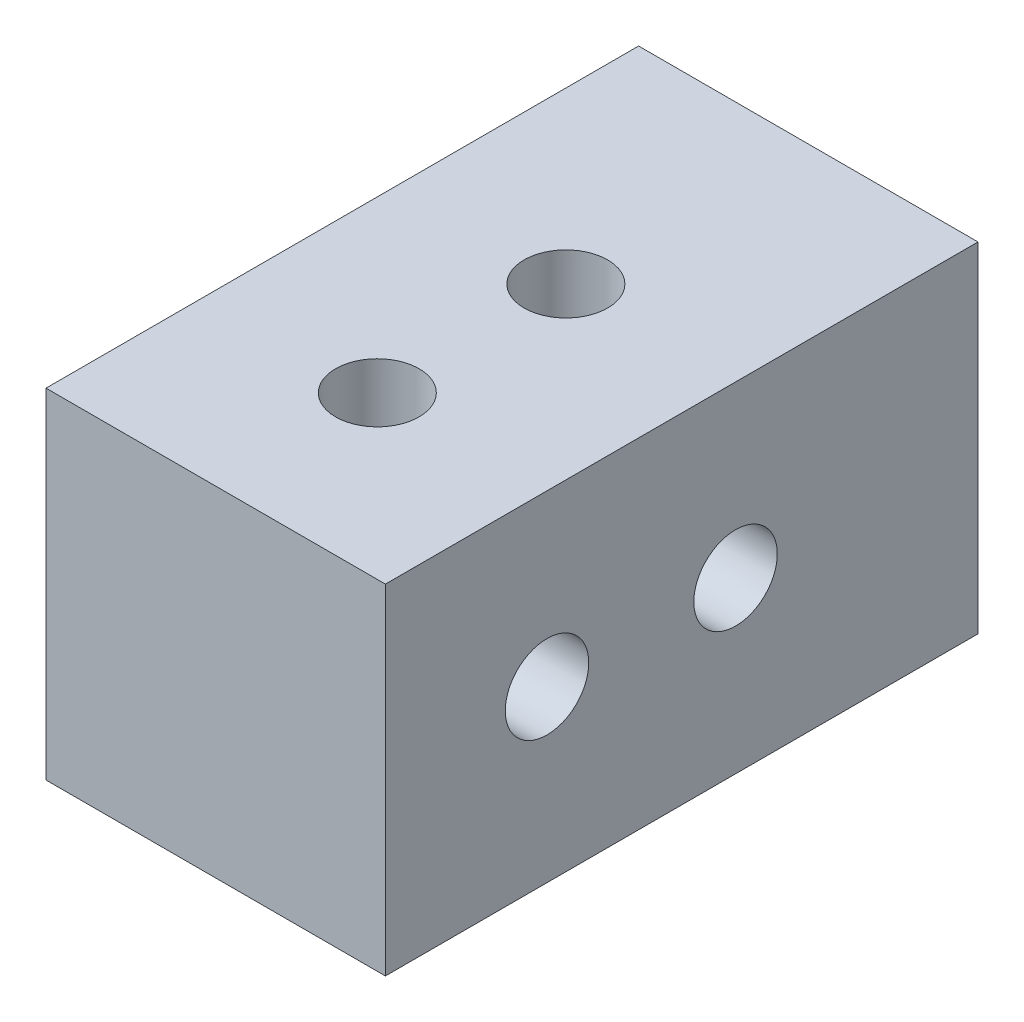
ISO-10303-21;
HEADER;
FILE_DESCRIPTION(('STEP AP214'),'2;1');
FILE_NAME('part.step','',(''),(''),'','','');
FILE_SCHEMA(('AUTOMOTIVE_DESIGN { 1 0 10303 214 1 1 1 1 }'));
ENDSEC;
DATA;
#1=APPLICATION_CONTEXT('core data for automotive mechanical design processes');
#2=APPLICATION_PROTOCOL_DEFINITION('international standard','automotive_design',2000,#1);
#3=PRODUCT_CONTEXT('',#1,'mechanical');
#4=PRODUCT('Part','Part','',(#3));
#5=PRODUCT_RELATED_PRODUCT_CATEGORY('part','',(#4));
#6=PRODUCT_DEFINITION_FORMATION('','',#4);
#7=PRODUCT_DEFINITION_CONTEXT('part definition',#1,'design');
#8=PRODUCT_DEFINITION('design','',#6,#7);
#9=PRODUCT_DEFINITION_SHAPE('','',#8);
#10=(LENGTH_UNIT() NAMED_UNIT(*) SI_UNIT(.MILLI.,.METRE.));
#11=(NAMED_UNIT(*) PLANE_ANGLE_UNIT() SI_UNIT($,.RADIAN.));
#12=(NAMED_UNIT(*) SI_UNIT($,.STERADIAN.) SOLID_ANGLE_UNIT());
#13=UNCERTAINTY_MEASURE_WITH_UNIT(LENGTH_MEASURE(1.E-05),#10,'distance_accuracy_value','');
#14=(GEOMETRIC_REPRESENTATION_CONTEXT(3) GLOBAL_UNCERTAINTY_ASSIGNED_CONTEXT((#13)) GLOBAL_UNIT_ASSIGNED_CONTEXT((#10,
#11,#12)) REPRESENTATION_CONTEXT('',''));
#15=CARTESIAN_POINT('',(0.,0.,0.));
#16=DIRECTION('',(0.,0.,1.));
#17=DIRECTION('',(1.,0.,0.));
#18=AXIS2_PLACEMENT_3D('',#15,#16,#17);
#19=CARTESIAN_POINT('',(0.,-6.301,16.));
#20=DIRECTION('',(0.,1.,0.));
#21=DIRECTION('',(0.,0.,1.));
#22=AXIS2_PLACEMENT_3D('',#19,#20,#21);
#23=CYLINDRICAL_SURFACE('',#22,1.55);
#24=CARTESIAN_POINT('',(0.,6.3,16.));
#25=DIRECTION('',(0.,1.,0.));
#26=DIRECTION('',(0.,0.,1.));
#27=AXIS2_PLACEMENT_3D('',#24,#25,#26);
#28=CIRCLE('',#27,1.55);
#29=CARTESIAN_POINT('',(0.,6.3,17.55));
#30=VERTEX_POINT('',#29);
#31=EDGE_CURVE('E230',#30,#30,#28,.T.);
#32=ORIENTED_EDGE('',*,*,#31,.T.);
#33=EDGE_LOOP('',(#32));
#34=FACE_BOUND('',#33,.T.);
#35=CARTESIAN_POINT('',(0.,0.,16.));
#36=DIRECTION('',(0.707106781186547,0.707106781186547,0.));
#37=DIRECTION('',(-0.707106781186547,0.707106781186547,0.));
#38=AXIS2_PLACEMENT_3D('',#35,#36,#37);
#39=ELLIPSE('',#38,2.1920310216783,1.55);
#40=CARTESIAN_POINT('',(0.,0.,17.55));
#41=VERTEX_POINT('',#40);
#42=CARTESIAN_POINT('',(0.,0.,14.45));
#43=VERTEX_POINT('',#42);
#44=EDGE_CURVE('E57',#41,#43,#39,.F.);
#45=ORIENTED_EDGE('',*,*,#44,.T.);
#46=CARTESIAN_POINT('',(0.,0.,16.));
#47=DIRECTION('',(-0.707106781186547,0.707106781186547,0.));
#48=DIRECTION('',(0.707106781186547,0.707106781186547,0.));
#49=AXIS2_PLACEMENT_3D('',#46,#47,#48);
#50=ELLIPSE('',#49,2.1920310216783,1.55);
#51=EDGE_CURVE('E11',#43,#41,#50,.F.);
#52=ORIENTED_EDGE('',*,*,#51,.T.);
#53=EDGE_LOOP('',(#45,#52));
#54=FACE_BOUND('',#53,.T.);
#55=ADVANCED_FACE('F43',(#34,#54),#23,.F.);
#56=CARTESIAN_POINT('',(0.,-6.301,9.));
#57=DIRECTION('',(0.,1.,0.));
#58=DIRECTION('',(0.,0.,1.));
#59=AXIS2_PLACEMENT_3D('',#56,#57,#58);
#60=CYLINDRICAL_SURFACE('',#59,1.55);
#61=CARTESIAN_POINT('',(0.,6.3,9.));
#62=DIRECTION('',(0.,1.,0.));
#63=DIRECTION('',(0.,0.,1.));
#64=AXIS2_PLACEMENT_3D('',#61,#62,#63);
#65=CIRCLE('',#64,1.55);
#66=CARTESIAN_POINT('',(0.,6.3,10.55));
#67=VERTEX_POINT('',#66);
#68=EDGE_CURVE('E235',#67,#67,#65,.T.);
#69=ORIENTED_EDGE('',*,*,#68,.T.);
#70=EDGE_LOOP('',(#69));
#71=FACE_BOUND('',#70,.T.);
#72=CARTESIAN_POINT('',(0.,0.,9.));
#73=DIRECTION('',(0.707106781186547,0.707106781186547,0.));
#74=DIRECTION('',(-0.707106781186547,0.707106781186547,0.));
#75=AXIS2_PLACEMENT_3D('',#72,#73,#74);
#76=ELLIPSE('',#75,2.1920310216783,1.55);
#77=CARTESIAN_POINT('',(0.,0.,10.55));
#78=VERTEX_POINT('',#77);
#79=CARTESIAN_POINT('',(0.,0.,7.45));
#80=VERTEX_POINT('',#79);
#81=EDGE_CURVE('E64',#78,#80,#76,.F.);
#82=ORIENTED_EDGE('',*,*,#81,.T.);
#83=CARTESIAN_POINT('',(0.,0.,9.));
#84=DIRECTION('',(-0.707106781186547,0.707106781186547,0.));
#85=DIRECTION('',(0.707106781186547,0.707106781186547,0.));
#86=AXIS2_PLACEMENT_3D('',#83,#84,#85);
#87=ELLIPSE('',#86,2.1920310216783,1.55);
#88=EDGE_CURVE('E100',#80,#78,#87,.F.);
#89=ORIENTED_EDGE('',*,*,#88,.T.);
#90=EDGE_LOOP('',(#82,#89));
#91=FACE_BOUND('',#90,.T.);
#92=ADVANCED_FACE('F111',(#71,#91),#60,.F.);
#93=CARTESIAN_POINT('',(-6.3,-6.3,22.));
#94=DIRECTION('',(1.,0.,0.));
#95=DIRECTION('',(0.,0.,-1.));
#96=AXIS2_PLACEMENT_3D('',#93,#94,#95);
#97=PLANE('',#96);
#98=CARTESIAN_POINT('',(-6.3,0.,9.));
#99=DIRECTION('',(-1.,0.,0.));
#100=DIRECTION('',(0.,0.,1.));
#101=AXIS2_PLACEMENT_3D('',#98,#99,#100);
#102=CIRCLE('',#101,1.55);
#103=CARTESIAN_POINT('',(-6.3,0.,10.55));
#104=VERTEX_POINT('',#103);
#105=EDGE_CURVE('E246',#104,#104,#102,.T.);
#106=ORIENTED_EDGE('',*,*,#105,.F.);
#107=EDGE_LOOP('',(#106));
#108=FACE_BOUND('',#107,.T.);
#109=CARTESIAN_POINT('',(-6.3,0.,16.));
#110=DIRECTION('',(-1.,0.,0.));
#111=DIRECTION('',(0.,0.,1.));
#112=AXIS2_PLACEMENT_3D('',#109,#110,#111);
#113=CIRCLE('',#112,1.55);
#114=CARTESIAN_POINT('',(-6.3,0.,17.55));
#115=VERTEX_POINT('',#114);
#116=EDGE_CURVE('E252',#115,#115,#113,.T.);
#117=ORIENTED_EDGE('',*,*,#116,.F.);
#118=EDGE_LOOP('',(#117));
#119=FACE_BOUND('',#118,.T.);
#120=DIRECTION('',(0.,-1.,0.));
#121=VECTOR('',#120,1.);
#122=CARTESIAN_POINT('',(-6.3,-6.3,0.));
#123=LINE('',#122,#121);
#124=CARTESIAN_POINT('',(-6.3,6.3,0.));
#125=VERTEX_POINT('',#124);
#126=CARTESIAN_POINT('',(-6.3,-6.3,0.));
#127=VERTEX_POINT('',#126);
#128=EDGE_CURVE('E192',#125,#127,#123,.T.);
#129=ORIENTED_EDGE('',*,*,#128,.T.);
#130=DIRECTION('',(0.,0.,-1.));
#131=VECTOR('',#130,1.);
#132=CARTESIAN_POINT('',(-6.3,-6.3,22.));
#133=LINE('',#132,#131);
#134=CARTESIAN_POINT('',(-6.3,-6.3,22.));
#135=VERTEX_POINT('',#134);
#136=EDGE_CURVE('E109',#135,#127,#133,.T.);
#137=ORIENTED_EDGE('',*,*,#136,.F.);
#138=DIRECTION('',(0.,-1.,0.));
#139=VECTOR('',#138,1.);
#140=CARTESIAN_POINT('',(-6.3,-6.3,22.));
#141=LINE('',#140,#139);
#142=CARTESIAN_POINT('',(-6.3,6.3,22.));
#143=VERTEX_POINT('',#142);
#144=EDGE_CURVE('E206',#143,#135,#141,.T.);
#145=ORIENTED_EDGE('',*,*,#144,.F.);
#146=DIRECTION('',(0.,0.,-1.));
#147=VECTOR('',#146,1.);
#148=CARTESIAN_POINT('',(-6.3,6.3,22.));
#149=LINE('',#148,#147);
#150=EDGE_CURVE('E210',#143,#125,#149,.T.);
#151=ORIENTED_EDGE('',*,*,#150,.T.);
#152=EDGE_LOOP('',(#129,#137,#145,#151));
#153=FACE_BOUND('',#152,.T.);
#154=ADVANCED_FACE('F45',(#108,#119,#153),#97,.F.);
#155=CARTESIAN_POINT('',(6.3,-6.3,22.));
#156=DIRECTION('',(0.,1.,0.));
#157=DIRECTION('',(0.,0.,1.));
#158=AXIS2_PLACEMENT_3D('',#155,#156,#157);
#159=PLANE('',#158);
#160=CARTESIAN_POINT('',(0.,-6.3,9.));
#161=DIRECTION('',(0.,1.,0.));
#162=DIRECTION('',(0.,0.,1.));
#163=AXIS2_PLACEMENT_3D('',#160,#161,#162);
#164=CIRCLE('',#163,1.55);
#165=CARTESIAN_POINT('',(0.,-6.3,10.55));
#166=VERTEX_POINT('',#165);
#167=EDGE_CURVE('E176',#166,#166,#164,.F.);
#168=ORIENTED_EDGE('',*,*,#167,.F.);
#169=EDGE_LOOP('',(#168));
#170=FACE_BOUND('',#169,.T.);
#171=CARTESIAN_POINT('',(0.,-6.3,16.));
#172=DIRECTION('',(0.,1.,0.));
#173=DIRECTION('',(0.,0.,1.));
#174=AXIS2_PLACEMENT_3D('',#171,#172,#173);
#175=CIRCLE('',#174,1.55);
#176=CARTESIAN_POINT('',(0.,-6.3,17.55));
#177=VERTEX_POINT('',#176);
#178=EDGE_CURVE('E180',#177,#177,#175,.F.);
#179=ORIENTED_EDGE('',*,*,#178,.F.);
#180=EDGE_LOOP('',(#179));
#181=FACE_BOUND('',#180,.T.);
#182=DIRECTION('',(1.,0.,0.));
#183=VECTOR('',#182,1.);
#184=CARTESIAN_POINT('',(6.3,-6.3,0.));
#185=LINE('',#184,#183);
#186=CARTESIAN_POINT('',(6.3,-6.3,0.));
#187=VERTEX_POINT('',#186);
#188=EDGE_CURVE('E183',#127,#187,#185,.T.);
#189=ORIENTED_EDGE('',*,*,#188,.T.);
#190=DIRECTION('',(0.,0.,-1.));
#191=VECTOR('',#190,1.);
#192=CARTESIAN_POINT('',(6.3,-6.3,22.));
#193=LINE('',#192,#191);
#194=CARTESIAN_POINT('',(6.3,-6.3,22.));
#195=VERTEX_POINT('',#194);
#196=EDGE_CURVE('E185',#195,#187,#193,.T.);
#197=ORIENTED_EDGE('',*,*,#196,.F.);
#198=DIRECTION('',(1.,0.,0.));
#199=VECTOR('',#198,1.);
#200=CARTESIAN_POINT('',(6.3,-6.3,22.));
#201=LINE('',#200,#199);
#202=EDGE_CURVE('E222',#135,#195,#201,.T.);
#203=ORIENTED_EDGE('',*,*,#202,.F.);
#204=ORIENTED_EDGE('',*,*,#136,.T.);
#205=EDGE_LOOP('',(#189,#197,#203,#204));
#206=FACE_BOUND('',#205,.T.);
#207=ADVANCED_FACE('F165',(#170,#181,#206),#159,.F.);
#208=CARTESIAN_POINT('',(6.3,-6.3,22.));
#209=DIRECTION('',(-1.,0.,0.));
#210=DIRECTION('',(0.,0.,1.));
#211=AXIS2_PLACEMENT_3D('',#208,#209,#210);
#212=PLANE('',#211);
#213=CARTESIAN_POINT('',(6.3,0.,9.));
#214=DIRECTION('',(-1.,0.,0.));
#215=DIRECTION('',(0.,0.,1.));
#216=AXIS2_PLACEMENT_3D('',#213,#214,#215);
#217=CIRCLE('',#216,1.55);
#218=CARTESIAN_POINT('',(6.3,0.,10.55));
#219=VERTEX_POINT('',#218);
#220=EDGE_CURVE('E242',#219,#219,#217,.F.);
#221=ORIENTED_EDGE('',*,*,#220,.F.);
#222=EDGE_LOOP('',(#221));
#223=FACE_BOUND('',#222,.T.);
#224=CARTESIAN_POINT('',(6.3,0.,16.));
#225=DIRECTION('',(-1.,0.,0.));
#226=DIRECTION('',(0.,0.,1.));
#227=AXIS2_PLACEMENT_3D('',#224,#225,#226);
#228=CIRCLE('',#227,1.55);
#229=CARTESIAN_POINT('',(6.3,0.,17.55));
#230=VERTEX_POINT('',#229);
#231=EDGE_CURVE('E255',#230,#230,#228,.F.);
#232=ORIENTED_EDGE('',*,*,#231,.F.);
#233=EDGE_LOOP('',(#232));
#234=FACE_BOUND('',#233,.T.);
#235=DIRECTION('',(0.,1.,0.));
#236=VECTOR('',#235,1.);
#237=CARTESIAN_POINT('',(6.3,-6.3,0.));
#238=LINE('',#237,#236);
#239=CARTESIAN_POINT('',(6.3,6.3,0.));
#240=VERTEX_POINT('',#239);
#241=EDGE_CURVE('E191',#187,#240,#238,.T.);
#242=ORIENTED_EDGE('',*,*,#241,.T.);
#243=DIRECTION('',(0.,0.,-1.));
#244=VECTOR('',#243,1.);
#245=CARTESIAN_POINT('',(6.3,6.3,22.));
#246=LINE('',#245,#244);
#247=CARTESIAN_POINT('',(6.3,6.3,22.));
#248=VERTEX_POINT('',#247);
#249=EDGE_CURVE('E199',#248,#240,#246,.T.);
#250=ORIENTED_EDGE('',*,*,#249,.F.);
#251=DIRECTION('',(0.,1.,0.));
#252=VECTOR('',#251,1.);
#253=CARTESIAN_POINT('',(6.3,-6.3,22.));
#254=LINE('',#253,#252);
#255=EDGE_CURVE('E197',#195,#248,#254,.T.);
#256=ORIENTED_EDGE('',*,*,#255,.F.);
#257=ORIENTED_EDGE('',*,*,#196,.T.);
#258=EDGE_LOOP('',(#242,#250,#256,#257));
#259=FACE_BOUND('',#258,.T.);
#260=ADVANCED_FACE('F162',(#223,#234,#259),#212,.F.);
#261=CARTESIAN_POINT('',(6.3,6.3,22.));
#262=DIRECTION('',(0.,-1.,0.));
#263=DIRECTION('',(0.,0.,-1.));
#264=AXIS2_PLACEMENT_3D('',#261,#262,#263);
#265=PLANE('',#264);
#266=ORIENTED_EDGE('',*,*,#68,.F.);
#267=EDGE_LOOP('',(#266));
#268=FACE_BOUND('',#267,.T.);
#269=ORIENTED_EDGE('',*,*,#31,.F.);
#270=EDGE_LOOP('',(#269));
#271=FACE_BOUND('',#270,.T.);
#272=DIRECTION('',(-1.,0.,0.));
#273=VECTOR('',#272,1.);
#274=CARTESIAN_POINT('',(6.3,6.3,0.));
#275=LINE('',#274,#273);
#276=EDGE_CURVE('E202',#240,#125,#275,.T.);
#277=ORIENTED_EDGE('',*,*,#276,.T.);
#278=ORIENTED_EDGE('',*,*,#150,.F.);
#279=DIRECTION('',(-1.,0.,0.));
#280=VECTOR('',#279,1.);
#281=CARTESIAN_POINT('',(6.3,6.3,22.));
#282=LINE('',#281,#280);
#283=EDGE_CURVE('E214',#248,#143,#282,.T.);
#284=ORIENTED_EDGE('',*,*,#283,.F.);
#285=ORIENTED_EDGE('',*,*,#249,.T.);
#286=EDGE_LOOP('',(#277,#278,#284,#285));
#287=FACE_BOUND('',#286,.T.);
#288=ADVANCED_FACE('F156',(#268,#271,#287),#265,.F.);
#289=CARTESIAN_POINT('',(0.,0.,22.));
#290=DIRECTION('',(0.,0.,1.));
#291=DIRECTION('',(1.,0.,0.));
#292=AXIS2_PLACEMENT_3D('',#289,#290,#291);
#293=PLANE('',#292);
#294=ORIENTED_EDGE('',*,*,#144,.T.);
#295=ORIENTED_EDGE('',*,*,#202,.T.);
#296=ORIENTED_EDGE('',*,*,#255,.T.);
#297=ORIENTED_EDGE('',*,*,#283,.T.);
#298=EDGE_LOOP('',(#294,#295,#296,#297));
#299=FACE_BOUND('',#298,.T.);
#300=ADVANCED_FACE('F150',(#299),#293,.T.);
#301=CARTESIAN_POINT('',(0.,0.,0.));
#302=DIRECTION('',(0.,0.,1.));
#303=DIRECTION('',(1.,0.,0.));
#304=AXIS2_PLACEMENT_3D('',#301,#302,#303);
#305=PLANE('',#304);
#306=ORIENTED_EDGE('',*,*,#128,.F.);
#307=ORIENTED_EDGE('',*,*,#276,.F.);
#308=ORIENTED_EDGE('',*,*,#241,.F.);
#309=ORIENTED_EDGE('',*,*,#188,.F.);
#310=EDGE_LOOP('',(#306,#307,#308,#309));
#311=FACE_BOUND('',#310,.T.);
#312=ADVANCED_FACE('F145',(#311),#305,.F.);
#313=CARTESIAN_POINT('',(0.,0.,16.));
#314=DIRECTION('',(0.707106781186547,0.707106781186547,0.));
#315=DIRECTION('',(-0.707106781186547,0.707106781186547,0.));
#316=AXIS2_PLACEMENT_3D('',#313,#314,#315);
#317=ELLIPSE('',#316,2.1920310216783,1.55);
#318=EDGE_CURVE('E121',#41,#43,#317,.T.);
#319=ORIENTED_EDGE('',*,*,#318,.T.);
#320=CARTESIAN_POINT('',(0.,0.,16.));
#321=DIRECTION('',(-0.707106781186547,0.707106781186547,0.));
#322=DIRECTION('',(0.707106781186547,0.707106781186547,0.));
#323=AXIS2_PLACEMENT_3D('',#320,#321,#322);
#324=ELLIPSE('',#323,2.1920310216783,1.55);
#325=EDGE_CURVE('E52',#43,#41,#324,.T.);
#326=ORIENTED_EDGE('',*,*,#325,.T.);
#327=EDGE_LOOP('',(#319,#326));
#328=FACE_BOUND('',#327,.T.);
#329=ORIENTED_EDGE('',*,*,#178,.T.);
#330=EDGE_LOOP('',(#329));
#331=FACE_BOUND('',#330,.T.);
#332=ADVANCED_FACE('F127',(#328,#331),#23,.F.);
#333=CARTESIAN_POINT('',(0.,0.,9.));
#334=DIRECTION('',(0.707106781186547,0.707106781186547,0.));
#335=DIRECTION('',(-0.707106781186547,0.707106781186547,0.));
#336=AXIS2_PLACEMENT_3D('',#333,#334,#335);
#337=ELLIPSE('',#336,2.1920310216783,1.55);
#338=EDGE_CURVE('E98',#78,#80,#337,.T.);
#339=ORIENTED_EDGE('',*,*,#338,.T.);
#340=CARTESIAN_POINT('',(0.,0.,9.));
#341=DIRECTION('',(-0.707106781186547,0.707106781186547,0.));
#342=DIRECTION('',(0.707106781186547,0.707106781186547,0.));
#343=AXIS2_PLACEMENT_3D('',#340,#341,#342);
#344=ELLIPSE('',#343,2.1920310216783,1.55);
#345=EDGE_CURVE('E104',#80,#78,#344,.T.);
#346=ORIENTED_EDGE('',*,*,#345,.T.);
#347=EDGE_LOOP('',(#339,#346));
#348=FACE_BOUND('',#347,.T.);
#349=ORIENTED_EDGE('',*,*,#167,.T.);
#350=EDGE_LOOP('',(#349));
#351=FACE_BOUND('',#350,.T.);
#352=ADVANCED_FACE('F114',(#348,#351),#60,.F.);
#353=CARTESIAN_POINT('',(10.6840620433566,0.,9.));
#354=DIRECTION('',(-1.,0.,0.));
#355=DIRECTION('',(0.,0.,1.));
#356=AXIS2_PLACEMENT_3D('',#353,#354,#355);
#357=CYLINDRICAL_SURFACE('',#356,1.55);
#358=ORIENTED_EDGE('',*,*,#105,.T.);
#359=EDGE_LOOP('',(#358));
#360=FACE_BOUND('',#359,.T.);
#361=ORIENTED_EDGE('',*,*,#81,.F.);
#362=ORIENTED_EDGE('',*,*,#345,.F.);
#363=EDGE_LOOP('',(#361,#362));
#364=FACE_BOUND('',#363,.T.);
#365=ADVANCED_FACE('F107',(#360,#364),#357,.F.);
#366=ORIENTED_EDGE('',*,*,#220,.T.);
#367=EDGE_LOOP('',(#366));
#368=FACE_BOUND('',#367,.T.);
#369=ORIENTED_EDGE('',*,*,#338,.F.);
#370=ORIENTED_EDGE('',*,*,#88,.F.);
#371=EDGE_LOOP('',(#369,#370));
#372=FACE_BOUND('',#371,.T.);
#373=ADVANCED_FACE('F99',(#368,#372),#357,.F.);
#374=CARTESIAN_POINT('',(10.6840620433566,0.,16.));
#375=DIRECTION('',(-1.,0.,0.));
#376=DIRECTION('',(0.,0.,1.));
#377=AXIS2_PLACEMENT_3D('',#374,#375,#376);
#378=CYLINDRICAL_SURFACE('',#377,1.55);
#379=ORIENTED_EDGE('',*,*,#116,.T.);
#380=EDGE_LOOP('',(#379));
#381=FACE_BOUND('',#380,.T.);
#382=ORIENTED_EDGE('',*,*,#44,.F.);
#383=ORIENTED_EDGE('',*,*,#325,.F.);
#384=EDGE_LOOP('',(#382,#383));
#385=FACE_BOUND('',#384,.T.);
#386=ADVANCED_FACE('F131',(#381,#385),#378,.F.);
#387=ORIENTED_EDGE('',*,*,#231,.T.);
#388=EDGE_LOOP('',(#387));
#389=FACE_BOUND('',#388,.T.);
#390=ORIENTED_EDGE('',*,*,#318,.F.);
#391=ORIENTED_EDGE('',*,*,#51,.F.);
#392=EDGE_LOOP('',(#390,#391));
#393=FACE_BOUND('',#392,.T.);
#394=ADVANCED_FACE('F133',(#389,#393),#378,.F.);
#395=CLOSED_SHELL('',(#55,#92,#154,#207,#260,#288,#300,#312,#332,#352,#365,#373,#386,#394));
#396=MANIFOLD_SOLID_BREP('B2',#395);
#397=ADVANCED_BREP_SHAPE_REPRESENTATION('',(#18,#396),#14);
#398=SHAPE_DEFINITION_REPRESENTATION(#9,#397);
ENDSEC;
END-ISO-10303-21;
